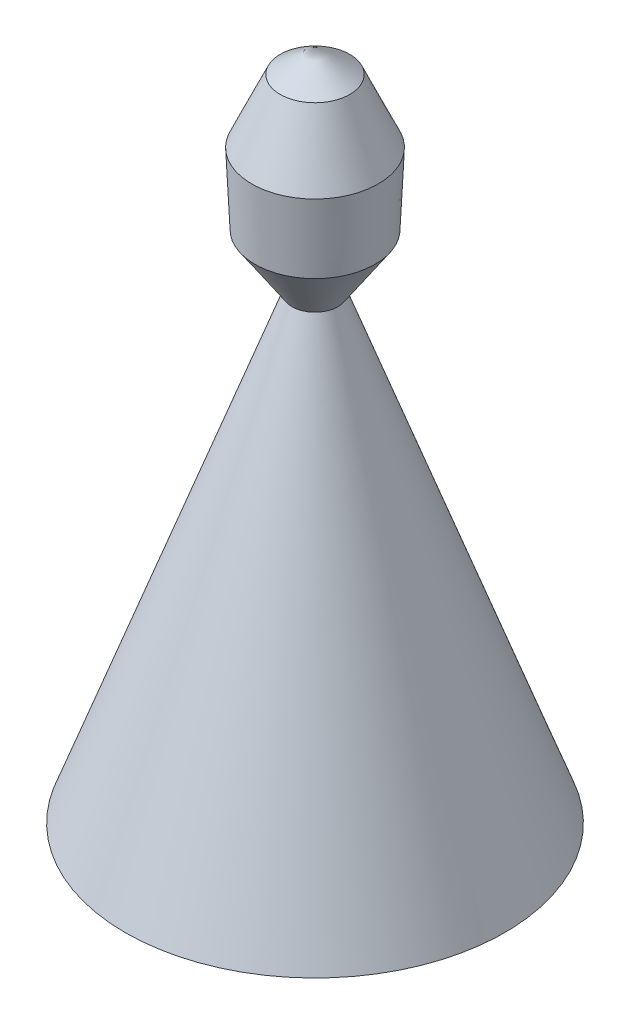
ISO-10303-21;
HEADER;
FILE_DESCRIPTION(('STEP AP214'),'2;1');
FILE_NAME('part.step','',(''),(''),'','','');
FILE_SCHEMA(('AUTOMOTIVE_DESIGN { 1 0 10303 214 1 1 1 1 }'));
ENDSEC;
DATA;
#1=APPLICATION_CONTEXT('core data for automotive mechanical design processes');
#2=APPLICATION_PROTOCOL_DEFINITION('international standard','automotive_design',2000,#1);
#3=PRODUCT_CONTEXT('',#1,'mechanical');
#4=PRODUCT('Part','Part','',(#3));
#5=PRODUCT_RELATED_PRODUCT_CATEGORY('part','',(#4));
#6=PRODUCT_DEFINITION_FORMATION('','',#4);
#7=PRODUCT_DEFINITION_CONTEXT('part definition',#1,'design');
#8=PRODUCT_DEFINITION('design','',#6,#7);
#9=PRODUCT_DEFINITION_SHAPE('','',#8);
#10=(LENGTH_UNIT() NAMED_UNIT(*) SI_UNIT(.MILLI.,.METRE.));
#11=(NAMED_UNIT(*) PLANE_ANGLE_UNIT() SI_UNIT($,.RADIAN.));
#12=(NAMED_UNIT(*) SI_UNIT($,.STERADIAN.) SOLID_ANGLE_UNIT());
#13=UNCERTAINTY_MEASURE_WITH_UNIT(LENGTH_MEASURE(1.E-05),#10,'distance_accuracy_value','');
#14=(GEOMETRIC_REPRESENTATION_CONTEXT(3) GLOBAL_UNCERTAINTY_ASSIGNED_CONTEXT((#13)) GLOBAL_UNIT_ASSIGNED_CONTEXT((#10,
#11,#12)) REPRESENTATION_CONTEXT('',''));
#15=CARTESIAN_POINT('',(0.,0.,0.));
#16=DIRECTION('',(0.,0.,1.));
#17=DIRECTION('',(1.,0.,0.));
#18=AXIS2_PLACEMENT_3D('',#15,#16,#17);
#19=CARTESIAN_POINT('',(0.,2950.,0.));
#20=DIRECTION('',(0.,-1.,0.));
#21=DIRECTION('',(0.,0.,-1.));
#22=AXIS2_PLACEMENT_3D('',#19,#20,#21);
#23=CONICAL_SURFACE('',#22,125.,0.345860812243071);
#24=CARTESIAN_POINT('',(0.,378.749192786806,0.));
#25=DIRECTION('',(0.,1.,0.));
#26=DIRECTION('',(0.,0.,1.));
#27=AXIS2_PLACEMENT_3D('',#24,#25,#26);
#28=CIRCLE('',#27,1051.53692880613);
#29=CARTESIAN_POINT('',(0.,378.749192786806,1051.53692880613));
#30=VERTEX_POINT('',#29);
#31=EDGE_CURVE('E50',#30,#30,#28,.F.);
#32=ORIENTED_EDGE('',*,*,#31,.F.);
#33=EDGE_LOOP('',(#32));
#34=FACE_BOUND('',#33,.T.);
#35=CARTESIAN_POINT('',(0.,50.,0.));
#36=DIRECTION('',(0.,-1.,0.));
#37=DIRECTION('',(0.,0.,-1.));
#38=AXIS2_PLACEMENT_3D('',#35,#36,#37);
#39=CIRCLE('',#38,1170.);
#40=CARTESIAN_POINT('',(0.,50.,-1170.));
#41=VERTEX_POINT('',#40);
#42=EDGE_CURVE('E77',#41,#41,#39,.T.);
#43=ORIENTED_EDGE('',*,*,#42,.T.);
#44=EDGE_LOOP('',(#43));
#45=FACE_BOUND('',#44,.T.);
#46=ADVANCED_FACE('F39',(#34,#45),#23,.F.);
#47=CARTESIAN_POINT('',(1200.,50.,0.));
#48=DIRECTION('',(0.,-1.,0.));
#49=DIRECTION('',(0.,0.,-1.));
#50=AXIS2_PLACEMENT_3D('',#47,#48,#49);
#51=PLANE('',#50);
#52=CARTESIAN_POINT('',(0.,50.,0.));
#53=DIRECTION('',(0.,-1.,0.));
#54=DIRECTION('',(0.,0.,-1.));
#55=AXIS2_PLACEMENT_3D('',#52,#53,#54);
#56=CIRCLE('',#55,1200.);
#57=CARTESIAN_POINT('',(0.,50.,-1200.));
#58=VERTEX_POINT('',#57);
#59=EDGE_CURVE('E71',#58,#58,#56,.T.);
#60=ORIENTED_EDGE('',*,*,#59,.T.);
#61=EDGE_LOOP('',(#60));
#62=FACE_BOUND('',#61,.T.);
#63=ORIENTED_EDGE('',*,*,#42,.F.);
#64=EDGE_LOOP('',(#63));
#65=FACE_BOUND('',#64,.T.);
#66=ADVANCED_FACE('F115',(#62,#65),#51,.T.);
#67=CARTESIAN_POINT('',(0.,50.,0.));
#68=DIRECTION('',(0.,-1.,0.));
#69=DIRECTION('',(0.,0.,-1.));
#70=AXIS2_PLACEMENT_3D('',#67,#68,#69);
#71=CONICAL_SURFACE('',#70,1200.,0.348909431047032);
#72=CARTESIAN_POINT('',(0.,2950.,0.));
#73=DIRECTION('',(0.,-1.,0.));
#74=DIRECTION('',(0.,0.,-1.));
#75=AXIS2_PLACEMENT_3D('',#72,#73,#74);
#76=CIRCLE('',#75,145.);
#77=CARTESIAN_POINT('',(0.,2950.,-145.));
#78=VERTEX_POINT('',#77);
#79=EDGE_CURVE('E69',#78,#78,#76,.T.);
#80=CARTESIAN_POINT('',(0.,2950.,-145.));
#81=CARTESIAN_POINT('',(0.,2919.79166666667,-155.989583333333));
#82=CARTESIAN_POINT('',(0.,2889.58333333333,-166.979166666667));
#83=CARTESIAN_POINT('',(0.,2829.16666666667,-188.958333333333));
#84=CARTESIAN_POINT('',(0.,2798.95833333333,-199.947916666667));
#85=CARTESIAN_POINT('',(0.,2738.54166666667,-221.927083333333));
#86=CARTESIAN_POINT('',(0.,2708.33333333333,-232.916666666667));
#87=CARTESIAN_POINT('',(0.,2647.91666666667,-254.895833333333));
#88=CARTESIAN_POINT('',(0.,2617.70833333333,-265.885416666667));
#89=CARTESIAN_POINT('',(0.,2557.29166666667,-287.864583333333));
#90=CARTESIAN_POINT('',(0.,2527.08333333333,-298.854166666667));
#91=CARTESIAN_POINT('',(0.,2466.66666666667,-320.833333333333));
#92=CARTESIAN_POINT('',(0.,2436.45833333333,-331.822916666667));
#93=CARTESIAN_POINT('',(0.,2376.04166666667,-353.802083333333));
#94=CARTESIAN_POINT('',(0.,2345.83333333333,-364.791666666667));
#95=CARTESIAN_POINT('',(0.,2285.41666666667,-386.770833333333));
#96=CARTESIAN_POINT('',(0.,2255.20833333333,-397.760416666667));
#97=CARTESIAN_POINT('',(0.,2194.79166666667,-419.739583333333));
#98=CARTESIAN_POINT('',(0.,2164.58333333333,-430.729166666667));
#99=CARTESIAN_POINT('',(0.,2104.16666666667,-452.708333333333));
#100=CARTESIAN_POINT('',(0.,2073.95833333333,-463.697916666667));
#101=CARTESIAN_POINT('',(0.,2013.54166666667,-485.677083333333));
#102=CARTESIAN_POINT('',(0.,1983.33333333333,-496.666666666667));
#103=CARTESIAN_POINT('',(0.,1922.91666666667,-518.645833333333));
#104=CARTESIAN_POINT('',(0.,1892.70833333333,-529.635416666667));
#105=CARTESIAN_POINT('',(0.,1832.29166666667,-551.614583333333));
#106=CARTESIAN_POINT('',(0.,1802.08333333333,-562.604166666667));
#107=CARTESIAN_POINT('',(0.,1741.66666666667,-584.583333333333));
#108=CARTESIAN_POINT('',(0.,1711.45833333333,-595.572916666667));
#109=CARTESIAN_POINT('',(0.,1651.04166666667,-617.552083333333));
#110=CARTESIAN_POINT('',(0.,1620.83333333333,-628.541666666667));
#111=CARTESIAN_POINT('',(0.,1560.41666666667,-650.520833333333));
#112=CARTESIAN_POINT('',(0.,1530.20833333333,-661.510416666667));
#113=CARTESIAN_POINT('',(0.,1469.79166666667,-683.489583333333));
#114=CARTESIAN_POINT('',(0.,1439.58333333333,-694.479166666667));
#115=CARTESIAN_POINT('',(0.,1379.16666666667,-716.458333333333));
#116=CARTESIAN_POINT('',(0.,1348.95833333333,-727.447916666667));
#117=CARTESIAN_POINT('',(0.,1288.54166666667,-749.427083333333));
#118=CARTESIAN_POINT('',(0.,1258.33333333333,-760.416666666667));
#119=CARTESIAN_POINT('',(0.,1197.91666666667,-782.395833333333));
#120=CARTESIAN_POINT('',(0.,1167.70833333333,-793.385416666667));
#121=CARTESIAN_POINT('',(0.,1107.29166666667,-815.364583333333));
#122=CARTESIAN_POINT('',(0.,1077.08333333333,-826.354166666667));
#123=CARTESIAN_POINT('',(0.,1016.66666666667,-848.333333333333));
#124=CARTESIAN_POINT('',(0.,986.458333333333,-859.322916666667));
#125=CARTESIAN_POINT('',(0.,926.041666666667,-881.302083333333));
#126=CARTESIAN_POINT('',(0.,895.833333333334,-892.291666666667));
#127=CARTESIAN_POINT('',(0.,835.416666666667,-914.270833333333));
#128=CARTESIAN_POINT('',(0.,805.208333333333,-925.260416666667));
#129=CARTESIAN_POINT('',(0.,744.791666666667,-947.239583333333));
#130=CARTESIAN_POINT('',(0.,714.583333333333,-958.229166666667));
#131=CARTESIAN_POINT('',(0.,654.166666666667,-980.208333333333));
#132=CARTESIAN_POINT('',(0.,623.958333333333,-991.197916666667));
#133=CARTESIAN_POINT('',(0.,563.541666666667,-1013.17708333333));
#134=CARTESIAN_POINT('',(0.,533.333333333333,-1024.16666666667));
#135=CARTESIAN_POINT('',(0.,472.916666666667,-1046.14583333333));
#136=CARTESIAN_POINT('',(0.,442.708333333333,-1057.13541666667));
#137=CARTESIAN_POINT('',(0.,382.291666666667,-1079.11458333333));
#138=CARTESIAN_POINT('',(0.,352.083333333333,-1090.10416666667));
#139=CARTESIAN_POINT('',(0.,291.666666666667,-1112.08333333333));
#140=CARTESIAN_POINT('',(0.,261.458333333333,-1123.07291666667));
#141=CARTESIAN_POINT('',(0.,201.041666666667,-1145.05208333333));
#142=CARTESIAN_POINT('',(0.,170.833333333333,-1156.04166666667));
#143=CARTESIAN_POINT('',(0.,110.416666666667,-1178.02083333333));
#144=CARTESIAN_POINT('',(0.,80.2083333333334,-1189.01041666667));
#145=CARTESIAN_POINT('',(0.,50.,-1200.));
#146=B_SPLINE_CURVE_WITH_KNOTS('',3,(#80,#81,#82,#83,#84,#85,#86,#87,#88,#89,#90,#91,#92,#93,
#94,#95,#96,#97,#98,#99,#100,#101,#102,#103,#104,#105,#106,#107,#108,#109,#110,#111,#112,#113,
#114,#115,#116,#117,#118,#119,#120,#121,#122,#123,#124,#125,#126,#127,#128,#129,#130,#131,#132,
#133,#134,#135,#136,#137,#138,#139,#140,#141,#142,#143,#144,#145),.UNSPECIFIED.,.F.,.F.,(4,2,2,
2,2,2,2,2,2,2,2,2,2,2,2,2,2,2,2,2,2,2,2,2,2,2,2,2,2,2,2,2,4),(0.,96.4356215387371,
192.871243077474,289.306864616211,385.742486154947,482.178107693685,578.613729232422,
675.049350771159,771.484972309895,867.920593848632,964.356215387369,1060.79183692611,
1157.22745846484,1253.66308000358,1350.09870154232,1446.53432308105,1542.96994461979,
1639.40556615853,1735.84118769726,1832.276809236,1928.71243077474,2025.14805231348,
2121.58367385221,2218.01929539095,2314.45491692969,2410.89053846842,2507.32616000716,
2603.7617815459,2700.19740308463,2796.63302462337,2893.06864616211,2989.50426770084,
3085.93988923958),.UNSPECIFIED.);
#147=EDGE_CURVE('BSEAM116',#78,#58,#146,.T.);
#148=ORIENTED_EDGE('',*,*,#79,.T.);
#149=ORIENTED_EDGE('',*,*,#59,.F.);
#150=ORIENTED_EDGE('',*,*,#147,.T.);
#151=ORIENTED_EDGE('',*,*,#147,.F.);
#152=EDGE_LOOP('',(#148,#150,#149,#151));
#153=FACE_BOUND('',#152,.T.);
#154=ADVANCED_FACE('F116',(#153),#71,.T.);
#155=CARTESIAN_POINT('',(0.,2950.,0.));
#156=DIRECTION('',(0.,1.,0.));
#157=DIRECTION('',(0.,0.,1.));
#158=AXIS2_PLACEMENT_3D('',#155,#156,#157);
#159=CONICAL_SURFACE('',#158,145.,0.591292065367122);
#160=CARTESIAN_POINT('',(0.,3300.,0.));
#161=DIRECTION('',(0.,-1.,0.));
#162=DIRECTION('',(0.,0.,-1.));
#163=AXIS2_PLACEMENT_3D('',#160,#161,#162);
#164=CIRCLE('',#163,380.);
#165=CARTESIAN_POINT('',(0.,3300.,-380.));
#166=VERTEX_POINT('',#165);
#167=EDGE_CURVE('E61',#166,#166,#164,.T.);
#168=ORIENTED_EDGE('',*,*,#167,.T.);
#169=EDGE_LOOP('',(#168));
#170=FACE_BOUND('',#169,.T.);
#171=ORIENTED_EDGE('',*,*,#79,.F.);
#172=EDGE_LOOP('',(#171));
#173=FACE_BOUND('',#172,.T.);
#174=ADVANCED_FACE('F130',(#170,#173),#159,.T.);
#175=CARTESIAN_POINT('',(0.,3300.,0.));
#176=DIRECTION('',(0.,1.,0.));
#177=DIRECTION('',(0.,0.,1.));
#178=AXIS2_PLACEMENT_3D('',#175,#176,#177);
#179=CONICAL_SURFACE('',#178,380.,0.0444152152469109);
#180=CARTESIAN_POINT('',(0.,3750.,0.));
#181=DIRECTION('',(0.,-1.,0.));
#182=DIRECTION('',(0.,0.,-1.));
#183=AXIS2_PLACEMENT_3D('',#180,#181,#182);
#184=CIRCLE('',#183,400.);
#185=CARTESIAN_POINT('',(0.,3750.,-400.));
#186=VERTEX_POINT('',#185);
#187=EDGE_CURVE('E62',#186,#186,#184,.T.);
#188=ORIENTED_EDGE('',*,*,#187,.T.);
#189=EDGE_LOOP('',(#188));
#190=FACE_BOUND('',#189,.T.);
#191=ORIENTED_EDGE('',*,*,#167,.F.);
#192=EDGE_LOOP('',(#191));
#193=FACE_BOUND('',#192,.T.);
#194=ADVANCED_FACE('F164',(#190,#193),#179,.T.);
#195=CARTESIAN_POINT('',(0.,3750.,0.));
#196=DIRECTION('',(0.,-1.,0.));
#197=DIRECTION('',(0.,0.,-1.));
#198=AXIS2_PLACEMENT_3D('',#195,#196,#197);
#199=CONICAL_SURFACE('',#198,400.,0.42285392613294);
#200=CARTESIAN_POINT('',(0.,4150.,0.));
#201=DIRECTION('',(0.,-1.,0.));
#202=DIRECTION('',(0.,0.,-1.));
#203=AXIS2_PLACEMENT_3D('',#200,#201,#202);
#204=CIRCLE('',#203,220.);
#205=CARTESIAN_POINT('',(0.,4150.,-220.));
#206=VERTEX_POINT('',#205);
#207=EDGE_CURVE('E56',#206,#206,#204,.T.);
#208=ORIENTED_EDGE('',*,*,#207,.T.);
#209=EDGE_LOOP('',(#208));
#210=FACE_BOUND('',#209,.T.);
#211=ORIENTED_EDGE('',*,*,#187,.F.);
#212=EDGE_LOOP('',(#211));
#213=FACE_BOUND('',#212,.T.);
#214=ADVANCED_FACE('F54',(#210,#213),#199,.T.);
#215=CARTESIAN_POINT('',(0.,4150.,0.));
#216=DIRECTION('',(0.,-1.,0.));
#217=DIRECTION('',(0.,0.,-1.));
#218=AXIS2_PLACEMENT_3D('',#215,#216,#217);
#219=CONICAL_SURFACE('',#218,220.,0.972377433316361);
#220=CARTESIAN_POINT('',(0.,4300.,0.));
#221=VERTEX_POINT('',#220);
#222=VERTEX_LOOP('',#221);
#223=FACE_BOUND('',#222,.T.);
#224=ORIENTED_EDGE('',*,*,#207,.F.);
#225=EDGE_LOOP('',(#224));
#226=FACE_BOUND('',#225,.T.);
#227=ADVANCED_FACE('F51',(#223,#226),#219,.T.);
#228=CARTESIAN_POINT('',(0.,400.,0.));
#229=DIRECTION('',(0.,-1.,0.));
#230=DIRECTION('',(0.,0.,-1.));
#231=AXIS2_PLACEMENT_3D('',#228,#229,#230);
#232=TOROIDAL_SURFACE('',#231,1050.,21.3063126178397);
#233=CARTESIAN_POINT('',(0.,417.346639417382,0.));
#234=DIRECTION('',(0.,-1.,0.));
#235=DIRECTION('',(0.,0.,-1.));
#236=AXIS2_PLACEMENT_3D('',#233,#234,#235);
#237=CIRCLE('',#236,1037.62853855477);
#238=CARTESIAN_POINT('',(0.,417.346639417382,-1037.62853855477));
#239=VERTEX_POINT('',#238);
#240=EDGE_CURVE('E11',#239,#239,#237,.F.);
#241=ORIENTED_EDGE('',*,*,#240,.T.);
#242=EDGE_LOOP('',(#241));
#243=FACE_BOUND('',#242,.T.);
#244=ORIENTED_EDGE('',*,*,#31,.T.);
#245=EDGE_LOOP('',(#244));
#246=FACE_BOUND('',#245,.T.);
#247=ADVANCED_FACE('F53',(#243,#246),#232,.T.);
#248=ORIENTED_EDGE('',*,*,#240,.F.);
#249=EDGE_LOOP('',(#248));
#250=FACE_BOUND('',#249,.T.);
#251=CARTESIAN_POINT('',(0.,979.929018293061,0.));
#252=DIRECTION('',(0.,1.,0.));
#253=DIRECTION('',(0.,0.,1.));
#254=AXIS2_PLACEMENT_3D('',#251,#252,#253);
#255=CIRCLE('',#254,834.904888235776);
#256=CARTESIAN_POINT('',(0.,979.929018293061,834.904888235776));
#257=VERTEX_POINT('',#256);
#258=EDGE_CURVE('E97',#257,#257,#255,.F.);
#259=ORIENTED_EDGE('',*,*,#258,.F.);
#260=EDGE_LOOP('',(#259));
#261=FACE_BOUND('',#260,.T.);
#262=ADVANCED_FACE('F111',(#250,#261),#23,.F.);
#263=CARTESIAN_POINT('',(0.,1000.,0.));
#264=DIRECTION('',(0.,-1.,0.));
#265=DIRECTION('',(0.,0.,-1.));
#266=AXIS2_PLACEMENT_3D('',#263,#264,#265);
#267=TOROIDAL_SURFACE('',#266,820.,25.);
#268=CARTESIAN_POINT('',(0.,1024.96493852141,0.));
#269=DIRECTION('',(0.,-1.,0.));
#270=DIRECTION('',(0.,0.,-1.));
#271=AXIS2_PLACEMENT_3D('',#268,#269,#270);
#272=CIRCLE('',#271,818.676427325907);
#273=CARTESIAN_POINT('',(0.,1024.96493852141,-818.676427325907));
#274=VERTEX_POINT('',#273);
#275=EDGE_CURVE('E43',#274,#274,#272,.F.);
#276=ORIENTED_EDGE('',*,*,#275,.T.);
#277=EDGE_LOOP('',(#276));
#278=FACE_BOUND('',#277,.T.);
#279=ORIENTED_EDGE('',*,*,#258,.T.);
#280=EDGE_LOOP('',(#279));
#281=FACE_BOUND('',#280,.T.);
#282=ADVANCED_FACE('F222',(#278,#281),#267,.T.);
#283=ORIENTED_EDGE('',*,*,#275,.F.);
#284=EDGE_LOOP('',(#283));
#285=FACE_BOUND('',#284,.T.);
#286=CARTESIAN_POINT('',(0.,1685.77357611293,0.));
#287=DIRECTION('',(0.,1.,0.));
#288=DIRECTION('',(0.,0.,1.));
#289=AXIS2_PLACEMENT_3D('',#286,#287,#288);
#290=CIRCLE('',#289,580.557452745515);
#291=CARTESIAN_POINT('',(0.,1685.77357611293,580.557452745515));
#292=VERTEX_POINT('',#291);
#293=EDGE_CURVE('E94',#292,#292,#290,.F.);
#294=ORIENTED_EDGE('',*,*,#293,.F.);
#295=EDGE_LOOP('',(#294));
#296=FACE_BOUND('',#295,.T.);
#297=ADVANCED_FACE('F158',(#285,#296),#23,.F.);
#298=CARTESIAN_POINT('',(0.,1700.,0.));
#299=DIRECTION('',(0.,-1.,0.));
#300=DIRECTION('',(0.,0.,-1.));
#301=AXIS2_PLACEMENT_3D('',#298,#299,#300);
#302=TOROIDAL_SURFACE('',#301,560.,25.);
#303=CARTESIAN_POINT('',(0.,1724.06932579483,0.));
#304=DIRECTION('',(0.,-1.,0.));
#305=DIRECTION('',(0.,0.,-1.));
#306=AXIS2_PLACEMENT_3D('',#303,#304,#305);
#307=CIRCLE('',#306,566.757777429106);
#308=CARTESIAN_POINT('',(0.,1724.06932579483,-566.757777429106));
#309=VERTEX_POINT('',#308);
#310=EDGE_CURVE('E100',#309,#309,#307,.F.);
#311=ORIENTED_EDGE('',*,*,#310,.T.);
#312=EDGE_LOOP('',(#311));
#313=FACE_BOUND('',#312,.T.);
#314=ORIENTED_EDGE('',*,*,#293,.T.);
#315=EDGE_LOOP('',(#314));
#316=FACE_BOUND('',#315,.T.);
#317=ADVANCED_FACE('F156',(#313,#316),#302,.T.);
#318=ORIENTED_EDGE('',*,*,#310,.F.);
#319=EDGE_LOOP('',(#318));
#320=FACE_BOUND('',#319,.T.);
#321=CARTESIAN_POINT('',(0.,2383.78863785416,0.));
#322=DIRECTION('',(0.,1.,0.));
#323=DIRECTION('',(0.,0.,1.));
#324=AXIS2_PLACEMENT_3D('',#321,#322,#323);
#325=CIRCLE('',#324,329.031335669794);
#326=CARTESIAN_POINT('',(0.,2383.78863785416,329.031335669794));
#327=VERTEX_POINT('',#326);
#328=EDGE_CURVE('E86',#327,#327,#325,.F.);
#329=ORIENTED_EDGE('',*,*,#328,.F.);
#330=EDGE_LOOP('',(#329));
#331=FACE_BOUND('',#330,.T.);
#332=ADVANCED_FACE('F149',(#320,#331),#23,.F.);
#333=CARTESIAN_POINT('',(0.,2400.,0.));
#334=DIRECTION('',(0.,-1.,0.));
#335=DIRECTION('',(0.,0.,-1.));
#336=AXIS2_PLACEMENT_3D('',#333,#334,#335);
#337=TOROIDAL_SURFACE('',#336,310.,24.9999999999999);
#338=CARTESIAN_POINT('',(0.,2424.62456880442,0.));
#339=DIRECTION('',(0.,-1.,0.));
#340=DIRECTION('',(0.,0.,-1.));
#341=AXIS2_PLACEMENT_3D('',#338,#339,#340);
#342=CIRCLE('',#341,314.316319172201);
#343=CARTESIAN_POINT('',(0.,2424.62456880442,-314.316319172201));
#344=VERTEX_POINT('',#343);
#345=EDGE_CURVE('E93',#344,#344,#342,.F.);
#346=ORIENTED_EDGE('',*,*,#345,.T.);
#347=EDGE_LOOP('',(#346));
#348=FACE_BOUND('',#347,.T.);
#349=ORIENTED_EDGE('',*,*,#328,.T.);
#350=EDGE_LOOP('',(#349));
#351=FACE_BOUND('',#350,.T.);
#352=ADVANCED_FACE('F139',(#348,#351),#337,.T.);
#353=CARTESIAN_POINT('',(340.,3750.,0.));
#354=DIRECTION('',(0.,-1.,0.));
#355=DIRECTION('',(0.,0.,-1.));
#356=AXIS2_PLACEMENT_3D('',#353,#354,#355);
#357=PLANE('',#356);
#358=CARTESIAN_POINT('',(0.,3750.,0.));
#359=DIRECTION('',(0.,-1.,0.));
#360=DIRECTION('',(0.,0.,-1.));
#361=AXIS2_PLACEMENT_3D('',#358,#359,#360);
#362=CIRCLE('',#361,340.);
#363=CARTESIAN_POINT('',(0.,3750.,-340.));
#364=VERTEX_POINT('',#363);
#365=EDGE_CURVE('E84',#364,#364,#362,.T.);
#366=ORIENTED_EDGE('',*,*,#365,.T.);
#367=EDGE_LOOP('',(#366));
#368=FACE_BOUND('',#367,.T.);
#369=ADVANCED_FACE('F41',(#368),#357,.T.);
#370=CARTESIAN_POINT('',(0.,0.,0.));
#371=DIRECTION('',(0.,-1.,0.));
#372=DIRECTION('',(0.,0.,-1.));
#373=AXIS2_PLACEMENT_3D('',#370,#371,#372);
#374=CYLINDRICAL_SURFACE('',#373,340.);
#375=CARTESIAN_POINT('',(0.,3300.,0.));
#376=DIRECTION('',(0.,-1.,0.));
#377=DIRECTION('',(0.,0.,-1.));
#378=AXIS2_PLACEMENT_3D('',#375,#376,#377);
#379=CIRCLE('',#378,340.);
#380=CARTESIAN_POINT('',(0.,3300.,-340.));
#381=VERTEX_POINT('',#380);
#382=EDGE_CURVE('E85',#381,#381,#379,.T.);
#383=ORIENTED_EDGE('',*,*,#382,.T.);
#384=EDGE_LOOP('',(#383));
#385=FACE_BOUND('',#384,.T.);
#386=ORIENTED_EDGE('',*,*,#365,.F.);
#387=EDGE_LOOP('',(#386));
#388=FACE_BOUND('',#387,.T.);
#389=ADVANCED_FACE('F134',(#385,#388),#374,.F.);
#390=CARTESIAN_POINT('',(0.,3300.,0.));
#391=DIRECTION('',(0.,1.,0.));
#392=DIRECTION('',(0.,0.,1.));
#393=AXIS2_PLACEMENT_3D('',#390,#391,#392);
#394=CONICAL_SURFACE('',#393,340.,0.550857534531717);
#395=CARTESIAN_POINT('',(0.,2950.,0.));
#396=DIRECTION('',(0.,-1.,0.));
#397=DIRECTION('',(0.,0.,-1.));
#398=AXIS2_PLACEMENT_3D('',#395,#396,#397);
#399=CIRCLE('',#398,125.);
#400=CARTESIAN_POINT('',(0.,2950.,-125.));
#401=VERTEX_POINT('',#400);
#402=EDGE_CURVE('E76',#401,#401,#399,.T.);
#403=ORIENTED_EDGE('',*,*,#402,.T.);
#404=EDGE_LOOP('',(#403));
#405=FACE_BOUND('',#404,.T.);
#406=ORIENTED_EDGE('',*,*,#382,.F.);
#407=EDGE_LOOP('',(#406));
#408=FACE_BOUND('',#407,.T.);
#409=ADVANCED_FACE('F135',(#405,#408),#394,.F.);
#410=ORIENTED_EDGE('',*,*,#345,.F.);
#411=EDGE_LOOP('',(#410));
#412=FACE_BOUND('',#411,.T.);
#413=ORIENTED_EDGE('',*,*,#402,.F.);
#414=EDGE_LOOP('',(#413));
#415=FACE_BOUND('',#414,.T.);
#416=ADVANCED_FACE('F113',(#412,#415),#23,.F.);
#417=CLOSED_SHELL('',(#46,#66,#154,#174,#194,#214,#227,#247,#262,#282,#297,#317,#332,#352,#369,
#389,#409,#416));
#418=MANIFOLD_SOLID_BREP('B2',#417);
#419=ADVANCED_BREP_SHAPE_REPRESENTATION('',(#18,#418),#14);
#420=SHAPE_DEFINITION_REPRESENTATION(#9,#419);
ENDSEC;
END-ISO-10303-21;
